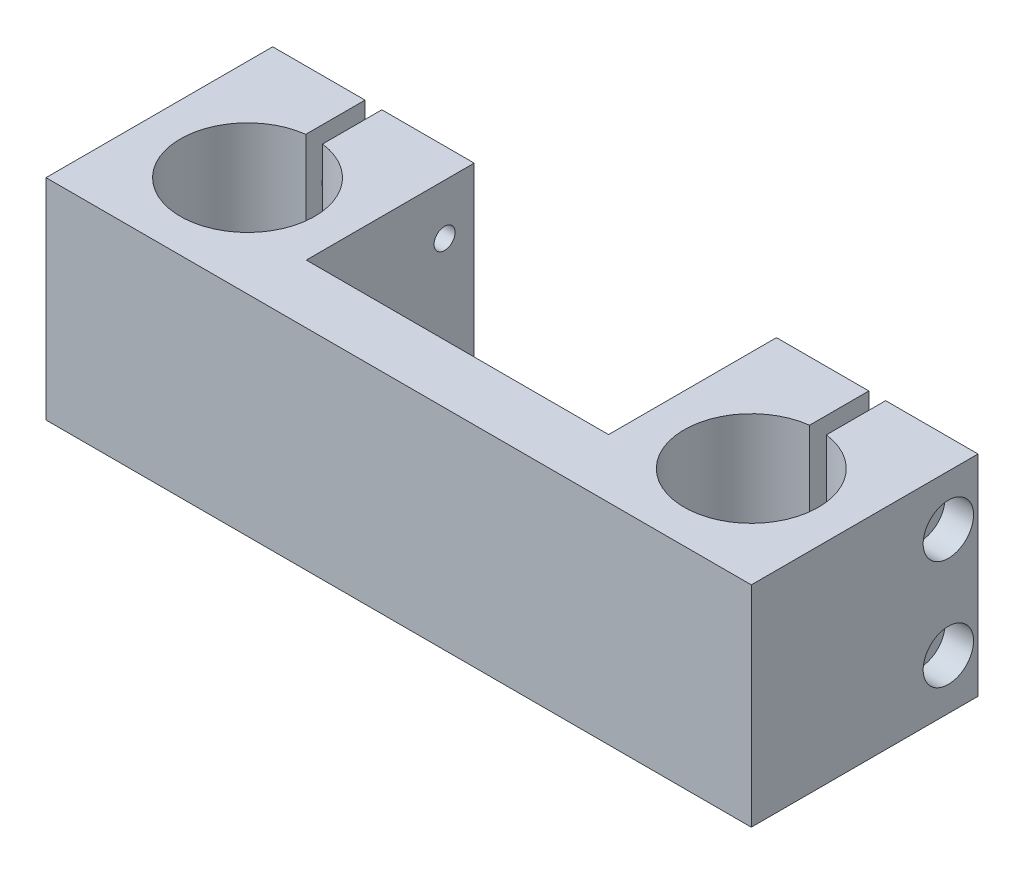
ISO-10303-21;
HEADER;
FILE_DESCRIPTION(('STEP AP214'),'2;1');
FILE_NAME('part.step','',(''),(''),'','','');
FILE_SCHEMA(('AUTOMOTIVE_DESIGN { 1 0 10303 214 1 1 1 1 }'));
ENDSEC;
DATA;
#1=APPLICATION_CONTEXT('core data for automotive mechanical design processes');
#2=APPLICATION_PROTOCOL_DEFINITION('international standard','automotive_design',2000,#1);
#3=PRODUCT_CONTEXT('',#1,'mechanical');
#4=PRODUCT('Part','Part','',(#3));
#5=PRODUCT_RELATED_PRODUCT_CATEGORY('part','',(#4));
#6=PRODUCT_DEFINITION_FORMATION('','',#4);
#7=PRODUCT_DEFINITION_CONTEXT('part definition',#1,'design');
#8=PRODUCT_DEFINITION('design','',#6,#7);
#9=PRODUCT_DEFINITION_SHAPE('','',#8);
#10=(LENGTH_UNIT() NAMED_UNIT(*) SI_UNIT(.MILLI.,.METRE.));
#11=(NAMED_UNIT(*) PLANE_ANGLE_UNIT() SI_UNIT($,.RADIAN.));
#12=(NAMED_UNIT(*) SI_UNIT($,.STERADIAN.) SOLID_ANGLE_UNIT());
#13=UNCERTAINTY_MEASURE_WITH_UNIT(LENGTH_MEASURE(1.E-05),#10,'distance_accuracy_value','');
#14=(GEOMETRIC_REPRESENTATION_CONTEXT(3) GLOBAL_UNCERTAINTY_ASSIGNED_CONTEXT((#13)) GLOBAL_UNIT_ASSIGNED_CONTEXT((#10,
#11,#12)) REPRESENTATION_CONTEXT('',''));
#15=CARTESIAN_POINT('',(0.,0.,0.));
#16=DIRECTION('',(0.,0.,1.));
#17=DIRECTION('',(1.,0.,0.));
#18=AXIS2_PLACEMENT_3D('',#15,#16,#17);
#19=CARTESIAN_POINT('',(0.,25.,0.));
#20=DIRECTION('',(0.,1.,0.));
#21=DIRECTION('',(0.,0.,1.));
#22=AXIS2_PLACEMENT_3D('',#19,#20,#21);
#23=PLANE('',#22);
#24=CARTESIAN_POINT('',(30.,25.,-12.));
#25=DIRECTION('',(0.,1.,0.));
#26=DIRECTION('',(0.,0.,-1.));
#27=AXIS2_PLACEMENT_3D('',#24,#25,#26);
#28=CIRCLE('',#27,8.);
#29=CARTESIAN_POINT('',(29.,25.,-19.9372539331938));
#30=VERTEX_POINT('',#29);
#31=CARTESIAN_POINT('',(31.,25.,-19.9372539331938));
#32=VERTEX_POINT('',#31);
#33=EDGE_CURVE('E179',#30,#32,#28,.T.);
#34=ORIENTED_EDGE('',*,*,#33,.F.);
#35=DIRECTION('',(0.,0.,-1.));
#36=VECTOR('',#35,1.);
#37=CARTESIAN_POINT('',(29.,25.,-27.));
#38=LINE('',#37,#36);
#39=CARTESIAN_POINT('',(29.,25.,-27.));
#40=VERTEX_POINT('',#39);
#41=EDGE_CURVE('E68',#30,#40,#38,.T.);
#42=ORIENTED_EDGE('',*,*,#41,.T.);
#43=DIRECTION('',(-1.,0.,0.));
#44=VECTOR('',#43,1.);
#45=CARTESIAN_POINT('',(18.,25.,-27.));
#46=LINE('',#45,#44);
#47=CARTESIAN_POINT('',(18.,25.,-27.));
#48=VERTEX_POINT('',#47);
#49=EDGE_CURVE('E199',#40,#48,#46,.T.);
#50=ORIENTED_EDGE('',*,*,#49,.T.);
#51=DIRECTION('',(0.,0.,1.));
#52=VECTOR('',#51,1.);
#53=CARTESIAN_POINT('',(18.,25.,-7.));
#54=LINE('',#53,#52);
#55=CARTESIAN_POINT('',(18.,25.,-7.));
#56=VERTEX_POINT('',#55);
#57=EDGE_CURVE('E204',#48,#56,#54,.T.);
#58=ORIENTED_EDGE('',*,*,#57,.T.);
#59=DIRECTION('',(-1.,0.,0.));
#60=VECTOR('',#59,1.);
#61=CARTESIAN_POINT('',(-18.,25.,-7.));
#62=LINE('',#61,#60);
#63=CARTESIAN_POINT('',(-18.,25.,-7.));
#64=VERTEX_POINT('',#63);
#65=EDGE_CURVE('E206',#56,#64,#62,.T.);
#66=ORIENTED_EDGE('',*,*,#65,.T.);
#67=DIRECTION('',(0.,0.,-1.));
#68=VECTOR('',#67,1.);
#69=CARTESIAN_POINT('',(-18.,25.,-27.));
#70=LINE('',#69,#68);
#71=CARTESIAN_POINT('',(-18.,25.,-27.));
#72=VERTEX_POINT('',#71);
#73=EDGE_CURVE('E208',#64,#72,#70,.T.);
#74=ORIENTED_EDGE('',*,*,#73,.T.);
#75=DIRECTION('',(-1.,0.,0.));
#76=VECTOR('',#75,1.);
#77=CARTESIAN_POINT('',(-42.,25.,-27.));
#78=LINE('',#77,#76);
#79=CARTESIAN_POINT('',(-29.,25.,-27.));
#80=VERTEX_POINT('',#79);
#81=EDGE_CURVE('E211',#72,#80,#78,.T.);
#82=ORIENTED_EDGE('',*,*,#81,.T.);
#83=DIRECTION('',(0.,0.,-1.));
#84=VECTOR('',#83,1.);
#85=CARTESIAN_POINT('',(-29.,25.,-27.));
#86=LINE('',#85,#84);
#87=CARTESIAN_POINT('',(-29.,25.,-19.9372539331938));
#88=VERTEX_POINT('',#87);
#89=EDGE_CURVE('E333',#88,#80,#86,.T.);
#90=ORIENTED_EDGE('',*,*,#89,.F.);
#91=CARTESIAN_POINT('',(-30.,25.,-12.));
#92=DIRECTION('',(0.,1.,0.));
#93=DIRECTION('',(0.,0.,1.));
#94=AXIS2_PLACEMENT_3D('',#91,#92,#93);
#95=CIRCLE('',#94,8.);
#96=CARTESIAN_POINT('',(-31.,25.,-19.9372539331938));
#97=VERTEX_POINT('',#96);
#98=EDGE_CURVE('E189',#97,#88,#95,.T.);
#99=ORIENTED_EDGE('',*,*,#98,.F.);
#100=DIRECTION('',(0.,0.,1.));
#101=VECTOR('',#100,1.);
#102=CARTESIAN_POINT('',(-31.,25.,-27.));
#103=LINE('',#102,#101);
#104=CARTESIAN_POINT('',(-31.,25.,-27.));
#105=VERTEX_POINT('',#104);
#106=EDGE_CURVE('E338',#105,#97,#103,.T.);
#107=ORIENTED_EDGE('',*,*,#106,.F.);
#108=CARTESIAN_POINT('',(-42.,25.,-27.));
#109=VERTEX_POINT('',#108);
#110=EDGE_CURVE('E210',#105,#109,#78,.T.);
#111=ORIENTED_EDGE('',*,*,#110,.T.);
#112=DIRECTION('',(0.,0.,1.));
#113=VECTOR('',#112,1.);
#114=CARTESIAN_POINT('',(-42.,25.,-27.));
#115=LINE('',#114,#113);
#116=CARTESIAN_POINT('',(-42.,25.,0.));
#117=VERTEX_POINT('',#116);
#118=EDGE_CURVE('E214',#109,#117,#115,.T.);
#119=ORIENTED_EDGE('',*,*,#118,.T.);
#120=DIRECTION('',(1.,0.,0.));
#121=VECTOR('',#120,1.);
#122=CARTESIAN_POINT('',(-42.,25.,0.));
#123=LINE('',#122,#121);
#124=CARTESIAN_POINT('',(42.,25.,0.));
#125=VERTEX_POINT('',#124);
#126=EDGE_CURVE('E217',#117,#125,#123,.T.);
#127=ORIENTED_EDGE('',*,*,#126,.T.);
#128=DIRECTION('',(0.,0.,-1.));
#129=VECTOR('',#128,1.);
#130=CARTESIAN_POINT('',(42.,25.,-27.));
#131=LINE('',#130,#129);
#132=CARTESIAN_POINT('',(42.,25.,-27.));
#133=VERTEX_POINT('',#132);
#134=EDGE_CURVE('E196',#125,#133,#131,.T.);
#135=ORIENTED_EDGE('',*,*,#134,.T.);
#136=CARTESIAN_POINT('',(31.,25.,-27.));
#137=VERTEX_POINT('',#136);
#138=EDGE_CURVE('E201',#133,#137,#46,.T.);
#139=ORIENTED_EDGE('',*,*,#138,.T.);
#140=DIRECTION('',(0.,0.,1.));
#141=VECTOR('',#140,1.);
#142=CARTESIAN_POINT('',(31.,25.,-27.));
#143=LINE('',#142,#141);
#144=EDGE_CURVE('E176',#137,#32,#143,.T.);
#145=ORIENTED_EDGE('',*,*,#144,.T.);
#146=EDGE_LOOP('',(#34,#42,#50,#58,#66,#74,#82,#90,#99,#107,#111,#119,#127,#135,#139,#145));
#147=FACE_BOUND('',#146,.T.);
#148=ADVANCED_FACE('F45',(#147),#23,.T.);
#149=CARTESIAN_POINT('',(0.,0.,0.));
#150=DIRECTION('',(0.,1.,0.));
#151=DIRECTION('',(0.,0.,1.));
#152=AXIS2_PLACEMENT_3D('',#149,#150,#151);
#153=PLANE('',#152);
#154=DIRECTION('',(0.,0.,-1.));
#155=VECTOR('',#154,1.);
#156=CARTESIAN_POINT('',(29.,0.,-27.));
#157=LINE('',#156,#155);
#158=CARTESIAN_POINT('',(29.,0.,-19.9372539331938));
#159=VERTEX_POINT('',#158);
#160=CARTESIAN_POINT('',(29.,0.,-27.));
#161=VERTEX_POINT('',#160);
#162=EDGE_CURVE('E160',#159,#161,#157,.T.);
#163=ORIENTED_EDGE('',*,*,#162,.F.);
#164=CARTESIAN_POINT('',(30.,0.,-12.));
#165=DIRECTION('',(0.,1.,0.));
#166=DIRECTION('',(0.,0.,-1.));
#167=AXIS2_PLACEMENT_3D('',#164,#165,#166);
#168=CIRCLE('',#167,8.);
#169=CARTESIAN_POINT('',(31.,0.,-19.9372539331938));
#170=VERTEX_POINT('',#169);
#171=EDGE_CURVE('E173',#159,#170,#168,.T.);
#172=ORIENTED_EDGE('',*,*,#171,.T.);
#173=DIRECTION('',(0.,0.,1.));
#174=VECTOR('',#173,1.);
#175=CARTESIAN_POINT('',(31.,0.,-27.));
#176=LINE('',#175,#174);
#177=CARTESIAN_POINT('',(31.,0.,-27.));
#178=VERTEX_POINT('',#177);
#179=EDGE_CURVE('E60',#178,#170,#176,.T.);
#180=ORIENTED_EDGE('',*,*,#179,.F.);
#181=DIRECTION('',(-1.,0.,0.));
#182=VECTOR('',#181,1.);
#183=CARTESIAN_POINT('',(18.,0.,-27.));
#184=LINE('',#183,#182);
#185=CARTESIAN_POINT('',(42.,0.,-27.));
#186=VERTEX_POINT('',#185);
#187=EDGE_CURVE('E222',#186,#178,#184,.T.);
#188=ORIENTED_EDGE('',*,*,#187,.F.);
#189=DIRECTION('',(0.,0.,-1.));
#190=VECTOR('',#189,1.);
#191=CARTESIAN_POINT('',(42.,0.,-27.));
#192=LINE('',#191,#190);
#193=CARTESIAN_POINT('',(42.,0.,0.));
#194=VERTEX_POINT('',#193);
#195=EDGE_CURVE('E193',#194,#186,#192,.T.);
#196=ORIENTED_EDGE('',*,*,#195,.F.);
#197=DIRECTION('',(1.,0.,0.));
#198=VECTOR('',#197,1.);
#199=CARTESIAN_POINT('',(-42.,0.,0.));
#200=LINE('',#199,#198);
#201=CARTESIAN_POINT('',(-42.,0.,0.));
#202=VERTEX_POINT('',#201);
#203=EDGE_CURVE('E200',#202,#194,#200,.T.);
#204=ORIENTED_EDGE('',*,*,#203,.F.);
#205=DIRECTION('',(0.,0.,1.));
#206=VECTOR('',#205,1.);
#207=CARTESIAN_POINT('',(-42.,0.,-27.));
#208=LINE('',#207,#206);
#209=CARTESIAN_POINT('',(-42.,0.,-27.));
#210=VERTEX_POINT('',#209);
#211=EDGE_CURVE('E236',#210,#202,#208,.T.);
#212=ORIENTED_EDGE('',*,*,#211,.F.);
#213=DIRECTION('',(-1.,0.,0.));
#214=VECTOR('',#213,1.);
#215=CARTESIAN_POINT('',(-42.,0.,-27.));
#216=LINE('',#215,#214);
#217=CARTESIAN_POINT('',(-31.,0.,-27.));
#218=VERTEX_POINT('',#217);
#219=EDGE_CURVE('E232',#218,#210,#216,.T.);
#220=ORIENTED_EDGE('',*,*,#219,.F.);
#221=DIRECTION('',(0.,0.,1.));
#222=VECTOR('',#221,1.);
#223=CARTESIAN_POINT('',(-31.,0.,-27.));
#224=LINE('',#223,#222);
#225=CARTESIAN_POINT('',(-31.,0.,-19.9372539331938));
#226=VERTEX_POINT('',#225);
#227=EDGE_CURVE('E337',#218,#226,#224,.T.);
#228=ORIENTED_EDGE('',*,*,#227,.T.);
#229=CARTESIAN_POINT('',(-30.,0.,-12.));
#230=DIRECTION('',(0.,1.,0.));
#231=DIRECTION('',(0.,0.,1.));
#232=AXIS2_PLACEMENT_3D('',#229,#230,#231);
#233=CIRCLE('',#232,8.);
#234=CARTESIAN_POINT('',(-29.,0.,-19.9372539331938));
#235=VERTEX_POINT('',#234);
#236=EDGE_CURVE('E182',#226,#235,#233,.T.);
#237=ORIENTED_EDGE('',*,*,#236,.T.);
#238=DIRECTION('',(0.,0.,-1.));
#239=VECTOR('',#238,1.);
#240=CARTESIAN_POINT('',(-29.,0.,-27.));
#241=LINE('',#240,#239);
#242=CARTESIAN_POINT('',(-29.,0.,-27.));
#243=VERTEX_POINT('',#242);
#244=EDGE_CURVE('E334',#235,#243,#241,.T.);
#245=ORIENTED_EDGE('',*,*,#244,.T.);
#246=CARTESIAN_POINT('',(-18.,0.,-27.));
#247=VERTEX_POINT('',#246);
#248=EDGE_CURVE('E233',#247,#243,#216,.T.);
#249=ORIENTED_EDGE('',*,*,#248,.F.);
#250=DIRECTION('',(0.,0.,-1.));
#251=VECTOR('',#250,1.);
#252=CARTESIAN_POINT('',(-18.,0.,-27.));
#253=LINE('',#252,#251);
#254=CARTESIAN_POINT('',(-18.,0.,-7.));
#255=VERTEX_POINT('',#254);
#256=EDGE_CURVE('E230',#255,#247,#253,.T.);
#257=ORIENTED_EDGE('',*,*,#256,.F.);
#258=DIRECTION('',(-1.,0.,0.));
#259=VECTOR('',#258,1.);
#260=CARTESIAN_POINT('',(-18.,0.,-7.));
#261=LINE('',#260,#259);
#262=CARTESIAN_POINT('',(18.,0.,-7.));
#263=VERTEX_POINT('',#262);
#264=EDGE_CURVE('E228',#263,#255,#261,.T.);
#265=ORIENTED_EDGE('',*,*,#264,.F.);
#266=DIRECTION('',(0.,0.,1.));
#267=VECTOR('',#266,1.);
#268=CARTESIAN_POINT('',(18.,0.,-7.));
#269=LINE('',#268,#267);
#270=CARTESIAN_POINT('',(18.,0.,-27.));
#271=VERTEX_POINT('',#270);
#272=EDGE_CURVE('E225',#271,#263,#269,.T.);
#273=ORIENTED_EDGE('',*,*,#272,.F.);
#274=EDGE_CURVE('E175',#161,#271,#184,.T.);
#275=ORIENTED_EDGE('',*,*,#274,.F.);
#276=EDGE_LOOP('',(#163,#172,#180,#188,#196,#204,#212,#220,#228,#237,#245,#249,#257,#265,#273,#275));
#277=FACE_BOUND('',#276,.T.);
#278=ADVANCED_FACE('F172',(#277),#153,.F.);
#279=CARTESIAN_POINT('',(18.,25.,-27.));
#280=DIRECTION('',(0.,0.,1.));
#281=DIRECTION('',(1.,0.,0.));
#282=AXIS2_PLACEMENT_3D('',#279,#280,#281);
#283=PLANE('',#282);
#284=DIRECTION('',(0.,1.,0.));
#285=VECTOR('',#284,1.);
#286=CARTESIAN_POINT('',(29.,0.,-27.));
#287=LINE('',#286,#285);
#288=EDGE_CURVE('E281',#161,#40,#287,.T.);
#289=ORIENTED_EDGE('',*,*,#288,.F.);
#290=ORIENTED_EDGE('',*,*,#274,.T.);
#291=DIRECTION('',(0.,-1.,0.));
#292=VECTOR('',#291,1.);
#293=CARTESIAN_POINT('',(18.,25.,-27.));
#294=LINE('',#293,#292);
#295=EDGE_CURVE('E53',#48,#271,#294,.T.);
#296=ORIENTED_EDGE('',*,*,#295,.F.);
#297=ORIENTED_EDGE('',*,*,#49,.F.);
#298=EDGE_LOOP('',(#289,#290,#296,#297));
#299=FACE_BOUND('',#298,.T.);
#300=ADVANCED_FACE('F280',(#299),#283,.F.);
#301=DIRECTION('',(0.,1.,0.));
#302=VECTOR('',#301,1.);
#303=CARTESIAN_POINT('',(31.,0.,-27.));
#304=LINE('',#303,#302);
#305=EDGE_CURVE('E283',#178,#137,#304,.T.);
#306=ORIENTED_EDGE('',*,*,#305,.T.);
#307=ORIENTED_EDGE('',*,*,#138,.F.);
#308=DIRECTION('',(0.,-1.,0.));
#309=VECTOR('',#308,1.);
#310=CARTESIAN_POINT('',(42.,25.,-27.));
#311=LINE('',#310,#309);
#312=EDGE_CURVE('E11',#133,#186,#311,.T.);
#313=ORIENTED_EDGE('',*,*,#312,.T.);
#314=ORIENTED_EDGE('',*,*,#187,.T.);
#315=EDGE_LOOP('',(#306,#307,#313,#314));
#316=FACE_BOUND('',#315,.T.);
#317=ADVANCED_FACE('F384',(#316),#283,.F.);
#318=CARTESIAN_POINT('',(30.,25.,-12.));
#319=DIRECTION('',(0.,-1.,0.));
#320=DIRECTION('',(0.,0.,-1.));
#321=AXIS2_PLACEMENT_3D('',#318,#319,#320);
#322=CYLINDRICAL_SURFACE('',#321,8.);
#323=ORIENTED_EDGE('',*,*,#33,.T.);
#324=DIRECTION('',(0.,1.,0.));
#325=VECTOR('',#324,1.);
#326=CARTESIAN_POINT('',(31.,0.,-19.9372539331938));
#327=LINE('',#326,#325);
#328=EDGE_CURVE('E167',#170,#32,#327,.T.);
#329=ORIENTED_EDGE('',*,*,#328,.F.);
#330=ORIENTED_EDGE('',*,*,#171,.F.);
#331=DIRECTION('',(0.,1.,0.));
#332=VECTOR('',#331,1.);
#333=CARTESIAN_POINT('',(29.,0.,-19.9372539331938));
#334=LINE('',#333,#332);
#335=EDGE_CURVE('E157',#159,#30,#334,.T.);
#336=ORIENTED_EDGE('',*,*,#335,.T.);
#337=EDGE_LOOP('',(#323,#329,#330,#336));
#338=FACE_BOUND('',#337,.T.);
#339=ADVANCED_FACE('F178',(#338),#322,.F.);
#340=CARTESIAN_POINT('',(-18.,25.,-27.));
#341=DIRECTION('',(-1.,0.,0.));
#342=DIRECTION('',(0.,0.,1.));
#343=AXIS2_PLACEMENT_3D('',#340,#341,#342);
#344=PLANE('',#343);
#345=ORIENTED_EDGE('',*,*,#256,.T.);
#346=DIRECTION('',(0.,-1.,0.));
#347=VECTOR('',#346,1.);
#348=CARTESIAN_POINT('',(-18.,25.,-27.));
#349=LINE('',#348,#347);
#350=EDGE_CURVE('E247',#72,#247,#349,.T.);
#351=ORIENTED_EDGE('',*,*,#350,.F.);
#352=ORIENTED_EDGE('',*,*,#73,.F.);
#353=DIRECTION('',(0.,-1.,0.));
#354=VECTOR('',#353,1.);
#355=CARTESIAN_POINT('',(-18.,25.,-7.));
#356=LINE('',#355,#354);
#357=EDGE_CURVE('E250',#64,#255,#356,.T.);
#358=ORIENTED_EDGE('',*,*,#357,.T.);
#359=EDGE_LOOP('',(#345,#351,#352,#358));
#360=FACE_BOUND('',#359,.T.);
#361=CARTESIAN_POINT('',(-18.,6.,-23.4686269665969));
#362=DIRECTION('',(1.,0.,0.));
#363=DIRECTION('',(0.,0.,-1.));
#364=AXIS2_PLACEMENT_3D('',#361,#362,#363);
#365=CIRCLE('',#364,1.25);
#366=CARTESIAN_POINT('',(-18.,6.,-24.7186269665969));
#367=VERTEX_POINT('',#366);
#368=EDGE_CURVE('E299',#367,#367,#365,.T.);
#369=ORIENTED_EDGE('',*,*,#368,.F.);
#370=EDGE_LOOP('',(#369));
#371=FACE_BOUND('',#370,.T.);
#372=CARTESIAN_POINT('',(-18.,19.,-23.4686269665969));
#373=DIRECTION('',(1.,0.,0.));
#374=DIRECTION('',(0.,0.,-1.));
#375=AXIS2_PLACEMENT_3D('',#372,#373,#374);
#376=CIRCLE('',#375,1.25);
#377=CARTESIAN_POINT('',(-18.,19.,-24.7186269665969));
#378=VERTEX_POINT('',#377);
#379=EDGE_CURVE('E282',#378,#378,#376,.T.);
#380=ORIENTED_EDGE('',*,*,#379,.F.);
#381=EDGE_LOOP('',(#380));
#382=FACE_BOUND('',#381,.T.);
#383=ADVANCED_FACE('F274',(#360,#371,#382),#344,.F.);
#384=CARTESIAN_POINT('',(-42.,25.,-27.));
#385=DIRECTION('',(1.,0.,0.));
#386=DIRECTION('',(0.,0.,-1.));
#387=AXIS2_PLACEMENT_3D('',#384,#385,#386);
#388=PLANE('',#387);
#389=CARTESIAN_POINT('',(-42.,19.,-23.4686269665969));
#390=DIRECTION('',(-1.,0.,0.));
#391=DIRECTION('',(0.,0.,1.));
#392=AXIS2_PLACEMENT_3D('',#389,#390,#391);
#393=CIRCLE('',#392,3.);
#394=CARTESIAN_POINT('',(-42.,19.,-20.4686269665969));
#395=VERTEX_POINT('',#394);
#396=EDGE_CURVE('E305',#395,#395,#393,.T.);
#397=ORIENTED_EDGE('',*,*,#396,.F.);
#398=EDGE_LOOP('',(#397));
#399=FACE_BOUND('',#398,.T.);
#400=ORIENTED_EDGE('',*,*,#211,.T.);
#401=DIRECTION('',(0.,-1.,0.));
#402=VECTOR('',#401,1.);
#403=CARTESIAN_POINT('',(-42.,25.,0.));
#404=LINE('',#403,#402);
#405=EDGE_CURVE('E241',#117,#202,#404,.T.);
#406=ORIENTED_EDGE('',*,*,#405,.F.);
#407=ORIENTED_EDGE('',*,*,#118,.F.);
#408=DIRECTION('',(0.,-1.,0.));
#409=VECTOR('',#408,1.);
#410=CARTESIAN_POINT('',(-42.,25.,-27.));
#411=LINE('',#410,#409);
#412=EDGE_CURVE('E244',#109,#210,#411,.T.);
#413=ORIENTED_EDGE('',*,*,#412,.T.);
#414=EDGE_LOOP('',(#400,#406,#407,#413));
#415=FACE_BOUND('',#414,.T.);
#416=CARTESIAN_POINT('',(-42.,6.,-23.4686269665969));
#417=DIRECTION('',(-1.,0.,0.));
#418=DIRECTION('',(0.,0.,1.));
#419=AXIS2_PLACEMENT_3D('',#416,#417,#418);
#420=CIRCLE('',#419,3.);
#421=CARTESIAN_POINT('',(-42.,6.,-20.4686269665969));
#422=VERTEX_POINT('',#421);
#423=EDGE_CURVE('E321',#422,#422,#420,.T.);
#424=ORIENTED_EDGE('',*,*,#423,.F.);
#425=EDGE_LOOP('',(#424));
#426=FACE_BOUND('',#425,.T.);
#427=ADVANCED_FACE('F372',(#399,#415,#426),#388,.F.);
#428=CARTESIAN_POINT('',(-42.,25.,-27.));
#429=DIRECTION('',(0.,0.,1.));
#430=DIRECTION('',(1.,0.,0.));
#431=AXIS2_PLACEMENT_3D('',#428,#429,#430);
#432=PLANE('',#431);
#433=ORIENTED_EDGE('',*,*,#248,.T.);
#434=DIRECTION('',(0.,1.,0.));
#435=VECTOR('',#434,1.);
#436=CARTESIAN_POINT('',(-29.,0.,-27.));
#437=LINE('',#436,#435);
#438=EDGE_CURVE('E341',#243,#80,#437,.T.);
#439=ORIENTED_EDGE('',*,*,#438,.T.);
#440=ORIENTED_EDGE('',*,*,#81,.F.);
#441=ORIENTED_EDGE('',*,*,#350,.T.);
#442=EDGE_LOOP('',(#433,#439,#440,#441));
#443=FACE_BOUND('',#442,.T.);
#444=ADVANCED_FACE('F352',(#443),#432,.F.);
#445=CARTESIAN_POINT('',(42.,25.,-27.));
#446=DIRECTION('',(-1.,0.,0.));
#447=DIRECTION('',(0.,0.,1.));
#448=AXIS2_PLACEMENT_3D('',#445,#446,#447);
#449=PLANE('',#448);
#450=CARTESIAN_POINT('',(42.,19.,-23.4686269665969));
#451=DIRECTION('',(1.,0.,0.));
#452=DIRECTION('',(0.,0.,-1.));
#453=AXIS2_PLACEMENT_3D('',#450,#451,#452);
#454=CIRCLE('',#453,3.);
#455=CARTESIAN_POINT('',(42.,19.,-26.4686269665969));
#456=VERTEX_POINT('',#455);
#457=EDGE_CURVE('E413',#456,#456,#454,.T.);
#458=ORIENTED_EDGE('',*,*,#457,.F.);
#459=EDGE_LOOP('',(#458));
#460=FACE_BOUND('',#459,.T.);
#461=CARTESIAN_POINT('',(42.,6.,-23.4686269665969));
#462=DIRECTION('',(1.,0.,0.));
#463=DIRECTION('',(0.,0.,-1.));
#464=AXIS2_PLACEMENT_3D('',#461,#462,#463);
#465=CIRCLE('',#464,3.);
#466=CARTESIAN_POINT('',(42.,6.,-26.4686269665969));
#467=VERTEX_POINT('',#466);
#468=EDGE_CURVE('E400',#467,#467,#465,.T.);
#469=ORIENTED_EDGE('',*,*,#468,.F.);
#470=EDGE_LOOP('',(#469));
#471=FACE_BOUND('',#470,.T.);
#472=ORIENTED_EDGE('',*,*,#195,.T.);
#473=ORIENTED_EDGE('',*,*,#312,.F.);
#474=ORIENTED_EDGE('',*,*,#134,.F.);
#475=DIRECTION('',(0.,-1.,0.));
#476=VECTOR('',#475,1.);
#477=CARTESIAN_POINT('',(42.,25.,0.));
#478=LINE('',#477,#476);
#479=EDGE_CURVE('E219',#125,#194,#478,.T.);
#480=ORIENTED_EDGE('',*,*,#479,.T.);
#481=EDGE_LOOP('',(#472,#473,#474,#480));
#482=FACE_BOUND('',#481,.T.);
#483=ADVANCED_FACE('F47',(#460,#471,#482),#449,.F.);
#484=CARTESIAN_POINT('',(18.,25.,-7.));
#485=DIRECTION('',(1.,0.,0.));
#486=DIRECTION('',(0.,0.,-1.));
#487=AXIS2_PLACEMENT_3D('',#484,#485,#486);
#488=PLANE('',#487);
#489=CARTESIAN_POINT('',(18.,19.,-23.4686269665969));
#490=DIRECTION('',(-1.,0.,0.));
#491=DIRECTION('',(0.,0.,1.));
#492=AXIS2_PLACEMENT_3D('',#489,#490,#491);
#493=CIRCLE('',#492,1.25);
#494=CARTESIAN_POINT('',(18.,19.,-22.2186269665969));
#495=VERTEX_POINT('',#494);
#496=EDGE_CURVE('E426',#495,#495,#493,.T.);
#497=ORIENTED_EDGE('',*,*,#496,.F.);
#498=EDGE_LOOP('',(#497));
#499=FACE_BOUND('',#498,.T.);
#500=CARTESIAN_POINT('',(18.,6.,-23.4686269665969));
#501=DIRECTION('',(-1.,0.,0.));
#502=DIRECTION('',(0.,0.,1.));
#503=AXIS2_PLACEMENT_3D('',#500,#501,#502);
#504=CIRCLE('',#503,1.25);
#505=CARTESIAN_POINT('',(18.,6.,-22.2186269665969));
#506=VERTEX_POINT('',#505);
#507=EDGE_CURVE('E420',#506,#506,#504,.T.);
#508=ORIENTED_EDGE('',*,*,#507,.F.);
#509=EDGE_LOOP('',(#508));
#510=FACE_BOUND('',#509,.T.);
#511=ORIENTED_EDGE('',*,*,#272,.T.);
#512=DIRECTION('',(0.,-1.,0.));
#513=VECTOR('',#512,1.);
#514=CARTESIAN_POINT('',(18.,25.,-7.));
#515=LINE('',#514,#513);
#516=EDGE_CURVE('E253',#56,#263,#515,.T.);
#517=ORIENTED_EDGE('',*,*,#516,.F.);
#518=ORIENTED_EDGE('',*,*,#57,.F.);
#519=ORIENTED_EDGE('',*,*,#295,.T.);
#520=EDGE_LOOP('',(#511,#517,#518,#519));
#521=FACE_BOUND('',#520,.T.);
#522=ADVANCED_FACE('F261',(#499,#510,#521),#488,.F.);
#523=CARTESIAN_POINT('',(-18.,25.,-7.));
#524=DIRECTION('',(0.,0.,1.));
#525=DIRECTION('',(1.,0.,0.));
#526=AXIS2_PLACEMENT_3D('',#523,#524,#525);
#527=PLANE('',#526);
#528=ORIENTED_EDGE('',*,*,#264,.T.);
#529=ORIENTED_EDGE('',*,*,#357,.F.);
#530=ORIENTED_EDGE('',*,*,#65,.F.);
#531=ORIENTED_EDGE('',*,*,#516,.T.);
#532=EDGE_LOOP('',(#528,#529,#530,#531));
#533=FACE_BOUND('',#532,.T.);
#534=ADVANCED_FACE('F270',(#533),#527,.F.);
#535=ORIENTED_EDGE('',*,*,#110,.F.);
#536=DIRECTION('',(0.,1.,0.));
#537=VECTOR('',#536,1.);
#538=CARTESIAN_POINT('',(-31.,0.,-27.));
#539=LINE('',#538,#537);
#540=EDGE_CURVE('E349',#218,#105,#539,.T.);
#541=ORIENTED_EDGE('',*,*,#540,.F.);
#542=ORIENTED_EDGE('',*,*,#219,.T.);
#543=ORIENTED_EDGE('',*,*,#412,.F.);
#544=EDGE_LOOP('',(#535,#541,#542,#543));
#545=FACE_BOUND('',#544,.T.);
#546=ADVANCED_FACE('F367',(#545),#432,.F.);
#547=CARTESIAN_POINT('',(-42.,25.,0.));
#548=DIRECTION('',(0.,0.,-1.));
#549=DIRECTION('',(-1.,0.,0.));
#550=AXIS2_PLACEMENT_3D('',#547,#548,#549);
#551=PLANE('',#550);
#552=ORIENTED_EDGE('',*,*,#203,.T.);
#553=ORIENTED_EDGE('',*,*,#479,.F.);
#554=ORIENTED_EDGE('',*,*,#126,.F.);
#555=ORIENTED_EDGE('',*,*,#405,.T.);
#556=EDGE_LOOP('',(#552,#553,#554,#555));
#557=FACE_BOUND('',#556,.T.);
#558=ADVANCED_FACE('F379',(#557),#551,.F.);
#559=CARTESIAN_POINT('',(-30.,25.,-12.));
#560=DIRECTION('',(0.,-1.,0.));
#561=DIRECTION('',(0.,0.,-1.));
#562=AXIS2_PLACEMENT_3D('',#559,#560,#561);
#563=CYLINDRICAL_SURFACE('',#562,8.);
#564=DIRECTION('',(0.,1.,0.));
#565=VECTOR('',#564,1.);
#566=CARTESIAN_POINT('',(-29.,0.,-19.9372539331938));
#567=LINE('',#566,#565);
#568=EDGE_CURVE('E180',#235,#88,#567,.T.);
#569=ORIENTED_EDGE('',*,*,#568,.F.);
#570=ORIENTED_EDGE('',*,*,#236,.F.);
#571=DIRECTION('',(0.,1.,0.));
#572=VECTOR('',#571,1.);
#573=CARTESIAN_POINT('',(-31.,0.,-19.9372539331938));
#574=LINE('',#573,#572);
#575=EDGE_CURVE('E185',#226,#97,#574,.T.);
#576=ORIENTED_EDGE('',*,*,#575,.T.);
#577=ORIENTED_EDGE('',*,*,#98,.T.);
#578=EDGE_LOOP('',(#569,#570,#576,#577));
#579=FACE_BOUND('',#578,.T.);
#580=ADVANCED_FACE('F359',(#579),#563,.F.);
#581=CARTESIAN_POINT('',(-31.,0.,-27.));
#582=DIRECTION('',(-1.,0.,0.));
#583=DIRECTION('',(0.,0.,1.));
#584=AXIS2_PLACEMENT_3D('',#581,#582,#583);
#585=PLANE('',#584);
#586=CARTESIAN_POINT('',(-31.,19.,-23.4686269665969));
#587=DIRECTION('',(-1.,0.,0.));
#588=DIRECTION('',(0.,0.,1.));
#589=AXIS2_PLACEMENT_3D('',#586,#587,#588);
#590=CIRCLE('',#589,1.6);
#591=CARTESIAN_POINT('',(-31.,19.,-21.8686269665969));
#592=VERTEX_POINT('',#591);
#593=EDGE_CURVE('E317',#592,#592,#590,.T.);
#594=ORIENTED_EDGE('',*,*,#593,.T.);
#595=EDGE_LOOP('',(#594));
#596=FACE_BOUND('',#595,.T.);
#597=CARTESIAN_POINT('',(-31.,6.,-23.4686269665969));
#598=DIRECTION('',(-1.,0.,0.));
#599=DIRECTION('',(0.,0.,1.));
#600=AXIS2_PLACEMENT_3D('',#597,#598,#599);
#601=CIRCLE('',#600,1.6);
#602=CARTESIAN_POINT('',(-31.,6.,-21.8686269665969));
#603=VERTEX_POINT('',#602);
#604=EDGE_CURVE('E330',#603,#603,#601,.T.);
#605=ORIENTED_EDGE('',*,*,#604,.T.);
#606=EDGE_LOOP('',(#605));
#607=FACE_BOUND('',#606,.T.);
#608=ORIENTED_EDGE('',*,*,#106,.T.);
#609=ORIENTED_EDGE('',*,*,#575,.F.);
#610=ORIENTED_EDGE('',*,*,#227,.F.);
#611=ORIENTED_EDGE('',*,*,#540,.T.);
#612=EDGE_LOOP('',(#608,#609,#610,#611));
#613=FACE_BOUND('',#612,.T.);
#614=ADVANCED_FACE('F493',(#596,#607,#613),#585,.F.);
#615=CARTESIAN_POINT('',(-29.,0.,-27.));
#616=DIRECTION('',(1.,0.,0.));
#617=DIRECTION('',(0.,0.,-1.));
#618=AXIS2_PLACEMENT_3D('',#615,#616,#617);
#619=PLANE('',#618);
#620=CARTESIAN_POINT('',(-29.,19.,-23.4686269665969));
#621=DIRECTION('',(1.,0.,0.));
#622=DIRECTION('',(0.,0.,-1.));
#623=AXIS2_PLACEMENT_3D('',#620,#621,#622);
#624=CIRCLE('',#623,1.25);
#625=CARTESIAN_POINT('',(-29.,19.,-24.7186269665969));
#626=VERTEX_POINT('',#625);
#627=EDGE_CURVE('E287',#626,#626,#624,.T.);
#628=ORIENTED_EDGE('',*,*,#627,.T.);
#629=EDGE_LOOP('',(#628));
#630=FACE_BOUND('',#629,.T.);
#631=CARTESIAN_POINT('',(-29.,6.,-23.4686269665969));
#632=DIRECTION('',(1.,0.,0.));
#633=DIRECTION('',(0.,0.,-1.));
#634=AXIS2_PLACEMENT_3D('',#631,#632,#633);
#635=CIRCLE('',#634,1.25);
#636=CARTESIAN_POINT('',(-29.,6.,-24.7186269665969));
#637=VERTEX_POINT('',#636);
#638=EDGE_CURVE('E302',#637,#637,#635,.T.);
#639=ORIENTED_EDGE('',*,*,#638,.T.);
#640=EDGE_LOOP('',(#639));
#641=FACE_BOUND('',#640,.T.);
#642=ORIENTED_EDGE('',*,*,#89,.T.);
#643=ORIENTED_EDGE('',*,*,#438,.F.);
#644=ORIENTED_EDGE('',*,*,#244,.F.);
#645=ORIENTED_EDGE('',*,*,#568,.T.);
#646=EDGE_LOOP('',(#642,#643,#644,#645));
#647=FACE_BOUND('',#646,.T.);
#648=ADVANCED_FACE('F354',(#630,#641,#647),#619,.F.);
#649=CARTESIAN_POINT('',(-42.,6.,-23.4686269665969));
#650=DIRECTION('',(-1.,0.,0.));
#651=DIRECTION('',(0.,0.,1.));
#652=AXIS2_PLACEMENT_3D('',#649,#650,#651);
#653=CYLINDRICAL_SURFACE('',#652,1.6);
#654=ORIENTED_EDGE('',*,*,#604,.F.);
#655=EDGE_LOOP('',(#654));
#656=FACE_BOUND('',#655,.T.);
#657=CARTESIAN_POINT('',(-38.6,6.,-23.4686269665969));
#658=DIRECTION('',(-1.,0.,0.));
#659=DIRECTION('',(0.,0.,1.));
#660=AXIS2_PLACEMENT_3D('',#657,#658,#659);
#661=CIRCLE('',#660,1.6);
#662=CARTESIAN_POINT('',(-38.6,6.,-21.8686269665969));
#663=VERTEX_POINT('',#662);
#664=EDGE_CURVE('E327',#663,#663,#661,.T.);
#665=ORIENTED_EDGE('',*,*,#664,.T.);
#666=EDGE_LOOP('',(#665));
#667=FACE_BOUND('',#666,.T.);
#668=ADVANCED_FACE('F492',(#656,#667),#653,.F.);
#669=CARTESIAN_POINT('',(-38.6,7.6,-23.4686269665969));
#670=DIRECTION('',(1.,0.,0.));
#671=DIRECTION('',(0.,0.,-1.));
#672=AXIS2_PLACEMENT_3D('',#669,#670,#671);
#673=PLANE('',#672);
#674=ORIENTED_EDGE('',*,*,#664,.F.);
#675=EDGE_LOOP('',(#674));
#676=FACE_BOUND('',#675,.T.);
#677=CARTESIAN_POINT('',(-38.6,6.,-23.4686269665969));
#678=DIRECTION('',(-1.,0.,0.));
#679=DIRECTION('',(0.,0.,1.));
#680=AXIS2_PLACEMENT_3D('',#677,#678,#679);
#681=CIRCLE('',#680,3.);
#682=CARTESIAN_POINT('',(-38.6,6.,-20.4686269665969));
#683=VERTEX_POINT('',#682);
#684=EDGE_CURVE('E324',#683,#683,#681,.T.);
#685=ORIENTED_EDGE('',*,*,#684,.T.);
#686=EDGE_LOOP('',(#685));
#687=FACE_BOUND('',#686,.T.);
#688=ADVANCED_FACE('F500',(#676,#687),#673,.F.);
#689=CARTESIAN_POINT('',(-42.,6.,-23.4686269665969));
#690=DIRECTION('',(-1.,0.,0.));
#691=DIRECTION('',(0.,0.,1.));
#692=AXIS2_PLACEMENT_3D('',#689,#690,#691);
#693=CYLINDRICAL_SURFACE('',#692,3.);
#694=ORIENTED_EDGE('',*,*,#684,.F.);
#695=EDGE_LOOP('',(#694));
#696=FACE_BOUND('',#695,.T.);
#697=ORIENTED_EDGE('',*,*,#423,.T.);
#698=EDGE_LOOP('',(#697));
#699=FACE_BOUND('',#698,.T.);
#700=ADVANCED_FACE('F504',(#696,#699),#693,.F.);
#701=CARTESIAN_POINT('',(-42.,19.,-23.4686269665969));
#702=DIRECTION('',(-1.,0.,0.));
#703=DIRECTION('',(0.,0.,1.));
#704=AXIS2_PLACEMENT_3D('',#701,#702,#703);
#705=CYLINDRICAL_SURFACE('',#704,1.6);
#706=ORIENTED_EDGE('',*,*,#593,.F.);
#707=EDGE_LOOP('',(#706));
#708=FACE_BOUND('',#707,.T.);
#709=CARTESIAN_POINT('',(-38.6,19.,-23.4686269665969));
#710=DIRECTION('',(-1.,0.,0.));
#711=DIRECTION('',(0.,0.,1.));
#712=AXIS2_PLACEMENT_3D('',#709,#710,#711);
#713=CIRCLE('',#712,1.6);
#714=CARTESIAN_POINT('',(-38.6,19.,-21.8686269665969));
#715=VERTEX_POINT('',#714);
#716=EDGE_CURVE('E313',#715,#715,#713,.T.);
#717=ORIENTED_EDGE('',*,*,#716,.T.);
#718=EDGE_LOOP('',(#717));
#719=FACE_BOUND('',#718,.T.);
#720=ADVANCED_FACE('F508',(#708,#719),#705,.F.);
#721=CARTESIAN_POINT('',(-38.6,20.6,-23.4686269665969));
#722=DIRECTION('',(1.,0.,0.));
#723=DIRECTION('',(0.,0.,-1.));
#724=AXIS2_PLACEMENT_3D('',#721,#722,#723);
#725=PLANE('',#724);
#726=ORIENTED_EDGE('',*,*,#716,.F.);
#727=EDGE_LOOP('',(#726));
#728=FACE_BOUND('',#727,.T.);
#729=CARTESIAN_POINT('',(-38.6,19.,-23.4686269665969));
#730=DIRECTION('',(-1.,0.,0.));
#731=DIRECTION('',(0.,0.,1.));
#732=AXIS2_PLACEMENT_3D('',#729,#730,#731);
#733=CIRCLE('',#732,3.);
#734=CARTESIAN_POINT('',(-38.6,19.,-20.4686269665969));
#735=VERTEX_POINT('',#734);
#736=EDGE_CURVE('E309',#735,#735,#733,.T.);
#737=ORIENTED_EDGE('',*,*,#736,.T.);
#738=EDGE_LOOP('',(#737));
#739=FACE_BOUND('',#738,.T.);
#740=ADVANCED_FACE('F512',(#728,#739),#725,.F.);
#741=CARTESIAN_POINT('',(-42.,19.,-23.4686269665969));
#742=DIRECTION('',(-1.,0.,0.));
#743=DIRECTION('',(0.,0.,1.));
#744=AXIS2_PLACEMENT_3D('',#741,#742,#743);
#745=CYLINDRICAL_SURFACE('',#744,3.);
#746=ORIENTED_EDGE('',*,*,#736,.F.);
#747=EDGE_LOOP('',(#746));
#748=FACE_BOUND('',#747,.T.);
#749=ORIENTED_EDGE('',*,*,#396,.T.);
#750=EDGE_LOOP('',(#749));
#751=FACE_BOUND('',#750,.T.);
#752=ADVANCED_FACE('F516',(#748,#751),#745,.F.);
#753=CARTESIAN_POINT('',(-18.,6.,-23.4686269665969));
#754=DIRECTION('',(1.,0.,0.));
#755=DIRECTION('',(0.,0.,-1.));
#756=AXIS2_PLACEMENT_3D('',#753,#754,#755);
#757=CYLINDRICAL_SURFACE('',#756,1.25);
#758=ORIENTED_EDGE('',*,*,#638,.F.);
#759=EDGE_LOOP('',(#758));
#760=FACE_BOUND('',#759,.T.);
#761=ORIENTED_EDGE('',*,*,#368,.T.);
#762=EDGE_LOOP('',(#761));
#763=FACE_BOUND('',#762,.T.);
#764=ADVANCED_FACE('F457',(#760,#763),#757,.F.);
#765=CARTESIAN_POINT('',(-18.,19.,-23.4686269665969));
#766=DIRECTION('',(1.,0.,0.));
#767=DIRECTION('',(0.,0.,-1.));
#768=AXIS2_PLACEMENT_3D('',#765,#766,#767);
#769=CYLINDRICAL_SURFACE('',#768,1.25);
#770=ORIENTED_EDGE('',*,*,#627,.F.);
#771=EDGE_LOOP('',(#770));
#772=FACE_BOUND('',#771,.T.);
#773=ORIENTED_EDGE('',*,*,#379,.T.);
#774=EDGE_LOOP('',(#773));
#775=FACE_BOUND('',#774,.T.);
#776=ADVANCED_FACE('F447',(#772,#775),#769,.F.);
#777=CARTESIAN_POINT('',(29.,0.,-27.));
#778=DIRECTION('',(1.,0.,0.));
#779=DIRECTION('',(0.,0.,-1.));
#780=AXIS2_PLACEMENT_3D('',#777,#778,#779);
#781=PLANE('',#780);
#782=CARTESIAN_POINT('',(29.,19.,-23.4686269665969));
#783=DIRECTION('',(1.,0.,0.));
#784=DIRECTION('',(0.,0.,-1.));
#785=AXIS2_PLACEMENT_3D('',#782,#783,#784);
#786=CIRCLE('',#785,1.25);
#787=CARTESIAN_POINT('',(29.,19.,-24.7186269665969));
#788=VERTEX_POINT('',#787);
#789=EDGE_CURVE('E423',#788,#788,#786,.T.);
#790=ORIENTED_EDGE('',*,*,#789,.F.);
#791=EDGE_LOOP('',(#790));
#792=FACE_BOUND('',#791,.T.);
#793=CARTESIAN_POINT('',(29.,6.,-23.4686269665969));
#794=DIRECTION('',(1.,0.,0.));
#795=DIRECTION('',(0.,0.,-1.));
#796=AXIS2_PLACEMENT_3D('',#793,#794,#795);
#797=CIRCLE('',#796,1.25);
#798=CARTESIAN_POINT('',(29.,6.,-24.7186269665969));
#799=VERTEX_POINT('',#798);
#800=EDGE_CURVE('E416',#799,#799,#797,.T.);
#801=ORIENTED_EDGE('',*,*,#800,.F.);
#802=EDGE_LOOP('',(#801));
#803=FACE_BOUND('',#802,.T.);
#804=ORIENTED_EDGE('',*,*,#41,.F.);
#805=ORIENTED_EDGE('',*,*,#335,.F.);
#806=ORIENTED_EDGE('',*,*,#162,.T.);
#807=ORIENTED_EDGE('',*,*,#288,.T.);
#808=EDGE_LOOP('',(#804,#805,#806,#807));
#809=FACE_BOUND('',#808,.T.);
#810=ADVANCED_FACE('F159',(#792,#803,#809),#781,.T.);
#811=CARTESIAN_POINT('',(31.,0.,-27.));
#812=DIRECTION('',(-1.,0.,0.));
#813=DIRECTION('',(0.,0.,1.));
#814=AXIS2_PLACEMENT_3D('',#811,#812,#813);
#815=PLANE('',#814);
#816=CARTESIAN_POINT('',(31.,19.,-23.4686269665969));
#817=DIRECTION('',(-1.,0.,0.));
#818=DIRECTION('',(0.,0.,1.));
#819=AXIS2_PLACEMENT_3D('',#816,#817,#818);
#820=CIRCLE('',#819,1.6);
#821=CARTESIAN_POINT('',(31.,19.,-21.8686269665969));
#822=VERTEX_POINT('',#821);
#823=EDGE_CURVE('E404',#822,#822,#820,.T.);
#824=ORIENTED_EDGE('',*,*,#823,.F.);
#825=EDGE_LOOP('',(#824));
#826=FACE_BOUND('',#825,.T.);
#827=CARTESIAN_POINT('',(31.,6.,-23.4686269665969));
#828=DIRECTION('',(-1.,0.,0.));
#829=DIRECTION('',(0.,0.,1.));
#830=AXIS2_PLACEMENT_3D('',#827,#828,#829);
#831=CIRCLE('',#830,1.6);
#832=CARTESIAN_POINT('',(31.,6.,-21.8686269665969));
#833=VERTEX_POINT('',#832);
#834=EDGE_CURVE('E386',#833,#833,#831,.T.);
#835=ORIENTED_EDGE('',*,*,#834,.F.);
#836=EDGE_LOOP('',(#835));
#837=FACE_BOUND('',#836,.T.);
#838=ORIENTED_EDGE('',*,*,#144,.F.);
#839=ORIENTED_EDGE('',*,*,#305,.F.);
#840=ORIENTED_EDGE('',*,*,#179,.T.);
#841=ORIENTED_EDGE('',*,*,#328,.T.);
#842=EDGE_LOOP('',(#838,#839,#840,#841));
#843=FACE_BOUND('',#842,.T.);
#844=ADVANCED_FACE('F446',(#826,#837,#843),#815,.T.);
#845=CARTESIAN_POINT('',(42.,6.,-23.4686269665969));
#846=DIRECTION('',(1.,0.,0.));
#847=DIRECTION('',(0.,0.,-1.));
#848=AXIS2_PLACEMENT_3D('',#845,#846,#847);
#849=CYLINDRICAL_SURFACE('',#848,1.6);
#850=CARTESIAN_POINT('',(38.6,6.,-23.4686269665969));
#851=DIRECTION('',(1.,0.,0.));
#852=DIRECTION('',(0.,0.,-1.));
#853=AXIS2_PLACEMENT_3D('',#850,#851,#852);
#854=CIRCLE('',#853,1.6);
#855=CARTESIAN_POINT('',(38.6,6.,-25.0686269665969));
#856=VERTEX_POINT('',#855);
#857=EDGE_CURVE('E389',#856,#856,#854,.T.);
#858=ORIENTED_EDGE('',*,*,#857,.T.);
#859=EDGE_LOOP('',(#858));
#860=FACE_BOUND('',#859,.T.);
#861=ORIENTED_EDGE('',*,*,#834,.T.);
#862=EDGE_LOOP('',(#861));
#863=FACE_BOUND('',#862,.T.);
#864=ADVANCED_FACE('F454',(#860,#863),#849,.F.);
#865=CARTESIAN_POINT('',(38.6,7.6,-23.4686269665969));
#866=DIRECTION('',(-1.,0.,0.));
#867=DIRECTION('',(0.,0.,1.));
#868=AXIS2_PLACEMENT_3D('',#865,#866,#867);
#869=PLANE('',#868);
#870=ORIENTED_EDGE('',*,*,#857,.F.);
#871=EDGE_LOOP('',(#870));
#872=FACE_BOUND('',#871,.T.);
#873=CARTESIAN_POINT('',(38.6,6.,-23.4686269665969));
#874=DIRECTION('',(1.,0.,0.));
#875=DIRECTION('',(0.,0.,-1.));
#876=AXIS2_PLACEMENT_3D('',#873,#874,#875);
#877=CIRCLE('',#876,3.);
#878=CARTESIAN_POINT('',(38.6,6.,-26.4686269665969));
#879=VERTEX_POINT('',#878);
#880=EDGE_CURVE('E396',#879,#879,#877,.T.);
#881=ORIENTED_EDGE('',*,*,#880,.T.);
#882=EDGE_LOOP('',(#881));
#883=FACE_BOUND('',#882,.T.);
#884=ADVANCED_FACE('F604',(#872,#883),#869,.F.);
#885=CARTESIAN_POINT('',(42.,6.,-23.4686269665969));
#886=DIRECTION('',(1.,0.,0.));
#887=DIRECTION('',(0.,0.,-1.));
#888=AXIS2_PLACEMENT_3D('',#885,#886,#887);
#889=CYLINDRICAL_SURFACE('',#888,3.);
#890=ORIENTED_EDGE('',*,*,#880,.F.);
#891=EDGE_LOOP('',(#890));
#892=FACE_BOUND('',#891,.T.);
#893=ORIENTED_EDGE('',*,*,#468,.T.);
#894=EDGE_LOOP('',(#893));
#895=FACE_BOUND('',#894,.T.);
#896=ADVANCED_FACE('F614',(#892,#895),#889,.F.);
#897=CARTESIAN_POINT('',(42.,19.,-23.4686269665969));
#898=DIRECTION('',(1.,0.,0.));
#899=DIRECTION('',(0.,0.,-1.));
#900=AXIS2_PLACEMENT_3D('',#897,#898,#899);
#901=CYLINDRICAL_SURFACE('',#900,1.6);
#902=CARTESIAN_POINT('',(38.6,19.,-23.4686269665969));
#903=DIRECTION('',(1.,0.,0.));
#904=DIRECTION('',(0.,0.,-1.));
#905=AXIS2_PLACEMENT_3D('',#902,#903,#904);
#906=CIRCLE('',#905,1.6);
#907=CARTESIAN_POINT('',(38.6,19.,-25.0686269665969));
#908=VERTEX_POINT('',#907);
#909=EDGE_CURVE('E407',#908,#908,#906,.T.);
#910=ORIENTED_EDGE('',*,*,#909,.T.);
#911=EDGE_LOOP('',(#910));
#912=FACE_BOUND('',#911,.T.);
#913=ORIENTED_EDGE('',*,*,#823,.T.);
#914=EDGE_LOOP('',(#913));
#915=FACE_BOUND('',#914,.T.);
#916=ADVANCED_FACE('F624',(#912,#915),#901,.F.);
#917=CARTESIAN_POINT('',(38.6,20.6,-23.4686269665969));
#918=DIRECTION('',(-1.,0.,0.));
#919=DIRECTION('',(0.,0.,1.));
#920=AXIS2_PLACEMENT_3D('',#917,#918,#919);
#921=PLANE('',#920);
#922=ORIENTED_EDGE('',*,*,#909,.F.);
#923=EDGE_LOOP('',(#922));
#924=FACE_BOUND('',#923,.T.);
#925=CARTESIAN_POINT('',(38.6,19.,-23.4686269665969));
#926=DIRECTION('',(1.,0.,0.));
#927=DIRECTION('',(0.,0.,-1.));
#928=AXIS2_PLACEMENT_3D('',#925,#926,#927);
#929=CIRCLE('',#928,3.);
#930=CARTESIAN_POINT('',(38.6,19.,-26.4686269665969));
#931=VERTEX_POINT('',#930);
#932=EDGE_CURVE('E410',#931,#931,#929,.T.);
#933=ORIENTED_EDGE('',*,*,#932,.T.);
#934=EDGE_LOOP('',(#933));
#935=FACE_BOUND('',#934,.T.);
#936=ADVANCED_FACE('F634',(#924,#935),#921,.F.);
#937=CARTESIAN_POINT('',(42.,19.,-23.4686269665969));
#938=DIRECTION('',(1.,0.,0.));
#939=DIRECTION('',(0.,0.,-1.));
#940=AXIS2_PLACEMENT_3D('',#937,#938,#939);
#941=CYLINDRICAL_SURFACE('',#940,3.);
#942=ORIENTED_EDGE('',*,*,#932,.F.);
#943=EDGE_LOOP('',(#942));
#944=FACE_BOUND('',#943,.T.);
#945=ORIENTED_EDGE('',*,*,#457,.T.);
#946=EDGE_LOOP('',(#945));
#947=FACE_BOUND('',#946,.T.);
#948=ADVANCED_FACE('F441',(#944,#947),#941,.F.);
#949=CARTESIAN_POINT('',(18.,6.,-23.4686269665969));
#950=DIRECTION('',(-1.,0.,0.));
#951=DIRECTION('',(0.,0.,1.));
#952=AXIS2_PLACEMENT_3D('',#949,#950,#951);
#953=CYLINDRICAL_SURFACE('',#952,1.25);
#954=ORIENTED_EDGE('',*,*,#507,.T.);
#955=EDGE_LOOP('',(#954));
#956=FACE_BOUND('',#955,.T.);
#957=ORIENTED_EDGE('',*,*,#800,.T.);
#958=EDGE_LOOP('',(#957));
#959=FACE_BOUND('',#958,.T.);
#960=ADVANCED_FACE('F438',(#956,#959),#953,.F.);
#961=CARTESIAN_POINT('',(18.,19.,-23.4686269665969));
#962=DIRECTION('',(-1.,0.,0.));
#963=DIRECTION('',(0.,0.,1.));
#964=AXIS2_PLACEMENT_3D('',#961,#962,#963);
#965=CYLINDRICAL_SURFACE('',#964,1.25);
#966=ORIENTED_EDGE('',*,*,#496,.T.);
#967=EDGE_LOOP('',(#966));
#968=FACE_BOUND('',#967,.T.);
#969=ORIENTED_EDGE('',*,*,#789,.T.);
#970=EDGE_LOOP('',(#969));
#971=FACE_BOUND('',#970,.T.);
#972=ADVANCED_FACE('F430',(#968,#971),#965,.F.);
#973=CLOSED_SHELL('',(#148,#278,#300,#317,#339,#383,#427,#444,#483,#522,#534,#546,#558,#580,
#614,#648,#668,#688,#700,#720,#740,#752,#764,#776,#810,#844,#864,#884,#896,#916,#936,#948,#960,#972));
#974=MANIFOLD_SOLID_BREP('B2',#973);
#975=ADVANCED_BREP_SHAPE_REPRESENTATION('',(#18,#974),#14);
#976=SHAPE_DEFINITION_REPRESENTATION(#9,#975);
ENDSEC;
END-ISO-10303-21;
